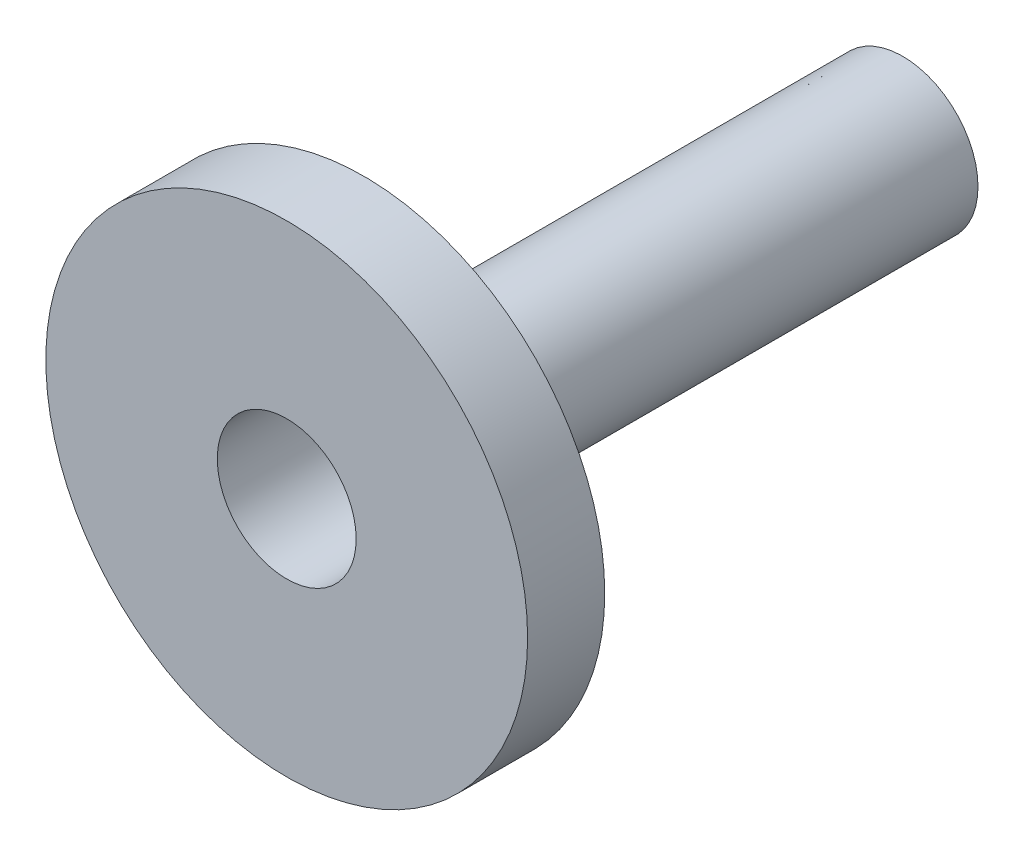
ISO-10303-21;
HEADER;
FILE_DESCRIPTION(('STEP AP214'),'2;1');
FILE_NAME('part.step','',(''),(''),'','','');
FILE_SCHEMA(('AUTOMOTIVE_DESIGN { 1 0 10303 214 1 1 1 1 }'));
ENDSEC;
DATA;
#1=APPLICATION_CONTEXT('core data for automotive mechanical design processes');
#2=APPLICATION_PROTOCOL_DEFINITION('international standard','automotive_design',2000,#1);
#3=PRODUCT_CONTEXT('',#1,'mechanical');
#4=PRODUCT('Part','Part','',(#3));
#5=PRODUCT_RELATED_PRODUCT_CATEGORY('part','',(#4));
#6=PRODUCT_DEFINITION_FORMATION('','',#4);
#7=PRODUCT_DEFINITION_CONTEXT('part definition',#1,'design');
#8=PRODUCT_DEFINITION('design','',#6,#7);
#9=PRODUCT_DEFINITION_SHAPE('','',#8);
#10=(LENGTH_UNIT() NAMED_UNIT(*) SI_UNIT(.MILLI.,.METRE.));
#11=(NAMED_UNIT(*) PLANE_ANGLE_UNIT() SI_UNIT($,.RADIAN.));
#12=(NAMED_UNIT(*) SI_UNIT($,.STERADIAN.) SOLID_ANGLE_UNIT());
#13=UNCERTAINTY_MEASURE_WITH_UNIT(LENGTH_MEASURE(1.E-05),#10,'distance_accuracy_value','');
#14=(GEOMETRIC_REPRESENTATION_CONTEXT(3) GLOBAL_UNCERTAINTY_ASSIGNED_CONTEXT((#13)) GLOBAL_UNIT_ASSIGNED_CONTEXT((#10,
#11,#12)) REPRESENTATION_CONTEXT('',''));
#15=CARTESIAN_POINT('',(0.,0.,0.));
#16=DIRECTION('',(0.,0.,1.));
#17=DIRECTION('',(1.,0.,0.));
#18=AXIS2_PLACEMENT_3D('',#15,#16,#17);
#19=CARTESIAN_POINT('',(0.,0.,-139.7));
#20=DIRECTION('',(0.,0.,1.));
#21=DIRECTION('',(1.,0.,0.));
#22=AXIS2_PLACEMENT_3D('',#19,#20,#21);
#23=CYLINDRICAL_SURFACE('',#22,19.5);
#24=CARTESIAN_POINT('',(0.,0.,-139.7));
#25=DIRECTION('',(0.,0.,1.));
#26=DIRECTION('',(1.,0.,0.));
#27=AXIS2_PLACEMENT_3D('',#24,#25,#26);
#28=CIRCLE('',#27,19.5);
#29=CARTESIAN_POINT('',(19.5,0.,-139.7));
#30=VERTEX_POINT('',#29);
#31=EDGE_CURVE('E10',#30,#30,#28,.T.);
#32=ORIENTED_EDGE('',*,*,#31,.T.);
#33=EDGE_LOOP('',(#32));
#34=FACE_BOUND('',#33,.T.);
#35=CARTESIAN_POINT('',(0.,0.,0.));
#36=DIRECTION('',(0.,0.,1.));
#37=DIRECTION('',(1.,0.,0.));
#38=AXIS2_PLACEMENT_3D('',#35,#36,#37);
#39=CIRCLE('',#38,19.5);
#40=CARTESIAN_POINT('',(19.5,0.,0.));
#41=VERTEX_POINT('',#40);
#42=EDGE_CURVE('E32',#41,#41,#39,.T.);
#43=ORIENTED_EDGE('',*,*,#42,.F.);
#44=EDGE_LOOP('',(#43));
#45=FACE_BOUND('',#44,.T.);
#46=ADVANCED_FACE('F29',(#34,#45),#23,.T.);
#47=CARTESIAN_POINT('',(0.,0.,-139.7));
#48=DIRECTION('',(0.,0.,1.));
#49=DIRECTION('',(1.,0.,0.));
#50=AXIS2_PLACEMENT_3D('',#47,#48,#49);
#51=PLANE('',#50);
#52=ORIENTED_EDGE('',*,*,#31,.F.);
#53=EDGE_LOOP('',(#52));
#54=FACE_BOUND('',#53,.T.);
#55=CARTESIAN_POINT('',(0.,0.,-139.7));
#56=DIRECTION('',(0.,0.,-1.));
#57=DIRECTION('',(-1.,0.,0.));
#58=AXIS2_PLACEMENT_3D('',#55,#56,#57);
#59=CIRCLE('',#58,14.5);
#60=CARTESIAN_POINT('',(-14.5,0.,-139.7));
#61=VERTEX_POINT('',#60);
#62=EDGE_CURVE('E49',#61,#61,#59,.T.);
#63=ORIENTED_EDGE('',*,*,#62,.F.);
#64=EDGE_LOOP('',(#63));
#65=FACE_BOUND('',#64,.T.);
#66=ADVANCED_FACE('F72',(#54,#65),#51,.F.);
#67=CARTESIAN_POINT('',(0.,0.,-139.7));
#68=DIRECTION('',(0.,0.,1.));
#69=DIRECTION('',(1.,0.,0.));
#70=AXIS2_PLACEMENT_3D('',#67,#68,#69);
#71=CYLINDRICAL_SURFACE('',#70,18.);
#72=CARTESIAN_POINT('',(0.,0.,-136.2));
#73=DIRECTION('',(0.,0.,-1.));
#74=DIRECTION('',(-1.,0.,0.));
#75=AXIS2_PLACEMENT_3D('',#72,#73,#74);
#76=CIRCLE('',#75,18.);
#77=CARTESIAN_POINT('',(-18.,0.,-136.2));
#78=VERTEX_POINT('',#77);
#79=EDGE_CURVE('E52',#78,#78,#76,.T.);
#80=ORIENTED_EDGE('',*,*,#79,.T.);
#81=EDGE_LOOP('',(#80));
#82=FACE_BOUND('',#81,.T.);
#83=CARTESIAN_POINT('',(0.,0.,19.9898));
#84=DIRECTION('',(0.,0.,1.));
#85=DIRECTION('',(1.,0.,0.));
#86=AXIS2_PLACEMENT_3D('',#83,#84,#85);
#87=CIRCLE('',#86,18.);
#88=CARTESIAN_POINT('',(18.,0.,19.9898));
#89=VERTEX_POINT('',#88);
#90=EDGE_CURVE('E44',#89,#89,#87,.T.);
#91=ORIENTED_EDGE('',*,*,#90,.T.);
#92=EDGE_LOOP('',(#91));
#93=FACE_BOUND('',#92,.T.);
#94=ADVANCED_FACE('F56',(#82,#93),#71,.F.);
#95=CARTESIAN_POINT('',(0.,0.,19.9898));
#96=DIRECTION('',(0.,0.,1.));
#97=DIRECTION('',(1.,0.,0.));
#98=AXIS2_PLACEMENT_3D('',#95,#96,#97);
#99=PLANE('',#98);
#100=CARTESIAN_POINT('',(0.,0.,19.9898));
#101=DIRECTION('',(0.,0.,1.));
#102=DIRECTION('',(1.,0.,0.));
#103=AXIS2_PLACEMENT_3D('',#100,#101,#102);
#104=CIRCLE('',#103,62.4462971326523);
#105=CARTESIAN_POINT('',(62.4462971326523,0.,19.9898));
#106=VERTEX_POINT('',#105);
#107=EDGE_CURVE('E39',#106,#106,#104,.T.);
#108=ORIENTED_EDGE('',*,*,#107,.T.);
#109=EDGE_LOOP('',(#108));
#110=FACE_BOUND('',#109,.T.);
#111=ORIENTED_EDGE('',*,*,#90,.F.);
#112=EDGE_LOOP('',(#111));
#113=FACE_BOUND('',#112,.T.);
#114=ADVANCED_FACE('F82',(#110,#113),#99,.T.);
#115=CARTESIAN_POINT('',(0.,0.,0.));
#116=DIRECTION('',(0.,0.,1.));
#117=DIRECTION('',(1.,0.,0.));
#118=AXIS2_PLACEMENT_3D('',#115,#116,#117);
#119=PLANE('',#118);
#120=ORIENTED_EDGE('',*,*,#42,.T.);
#121=EDGE_LOOP('',(#120));
#122=FACE_BOUND('',#121,.T.);
#123=CARTESIAN_POINT('',(0.,0.,0.));
#124=DIRECTION('',(0.,0.,1.));
#125=DIRECTION('',(1.,0.,0.));
#126=AXIS2_PLACEMENT_3D('',#123,#124,#125);
#127=CIRCLE('',#126,62.4462971326523);
#128=CARTESIAN_POINT('',(62.4462971326523,0.,0.));
#129=VERTEX_POINT('',#128);
#130=EDGE_CURVE('E41',#129,#129,#127,.T.);
#131=ORIENTED_EDGE('',*,*,#130,.F.);
#132=EDGE_LOOP('',(#131));
#133=FACE_BOUND('',#132,.T.);
#134=ADVANCED_FACE('F67',(#122,#133),#119,.F.);
#135=CARTESIAN_POINT('',(0.,0.,19.9898));
#136=DIRECTION('',(0.,0.,-1.));
#137=DIRECTION('',(-1.,0.,0.));
#138=AXIS2_PLACEMENT_3D('',#135,#136,#137);
#139=CYLINDRICAL_SURFACE('',#138,62.4462971326523);
#140=ORIENTED_EDGE('',*,*,#107,.F.);
#141=EDGE_LOOP('',(#140));
#142=FACE_BOUND('',#141,.T.);
#143=ORIENTED_EDGE('',*,*,#130,.T.);
#144=EDGE_LOOP('',(#143));
#145=FACE_BOUND('',#144,.T.);
#146=ADVANCED_FACE('F61',(#142,#145),#139,.T.);
#147=CARTESIAN_POINT('',(0.,0.,-136.2));
#148=DIRECTION('',(0.,0.,1.));
#149=DIRECTION('',(1.,0.,0.));
#150=AXIS2_PLACEMENT_3D('',#147,#148,#149);
#151=CONICAL_SURFACE('',#150,18.,0.785398163397448);
#152=ORIENTED_EDGE('',*,*,#62,.T.);
#153=EDGE_LOOP('',(#152));
#154=FACE_BOUND('',#153,.T.);
#155=ORIENTED_EDGE('',*,*,#79,.F.);
#156=EDGE_LOOP('',(#155));
#157=FACE_BOUND('',#156,.T.);
#158=ADVANCED_FACE('F59',(#154,#157),#151,.F.);
#159=CLOSED_SHELL('',(#46,#66,#94,#114,#134,#146,#158));
#160=MANIFOLD_SOLID_BREP('B2',#159);
#161=ADVANCED_BREP_SHAPE_REPRESENTATION('',(#18,#160),#14);
#162=SHAPE_DEFINITION_REPRESENTATION(#9,#161);
ENDSEC;
END-ISO-10303-21;
